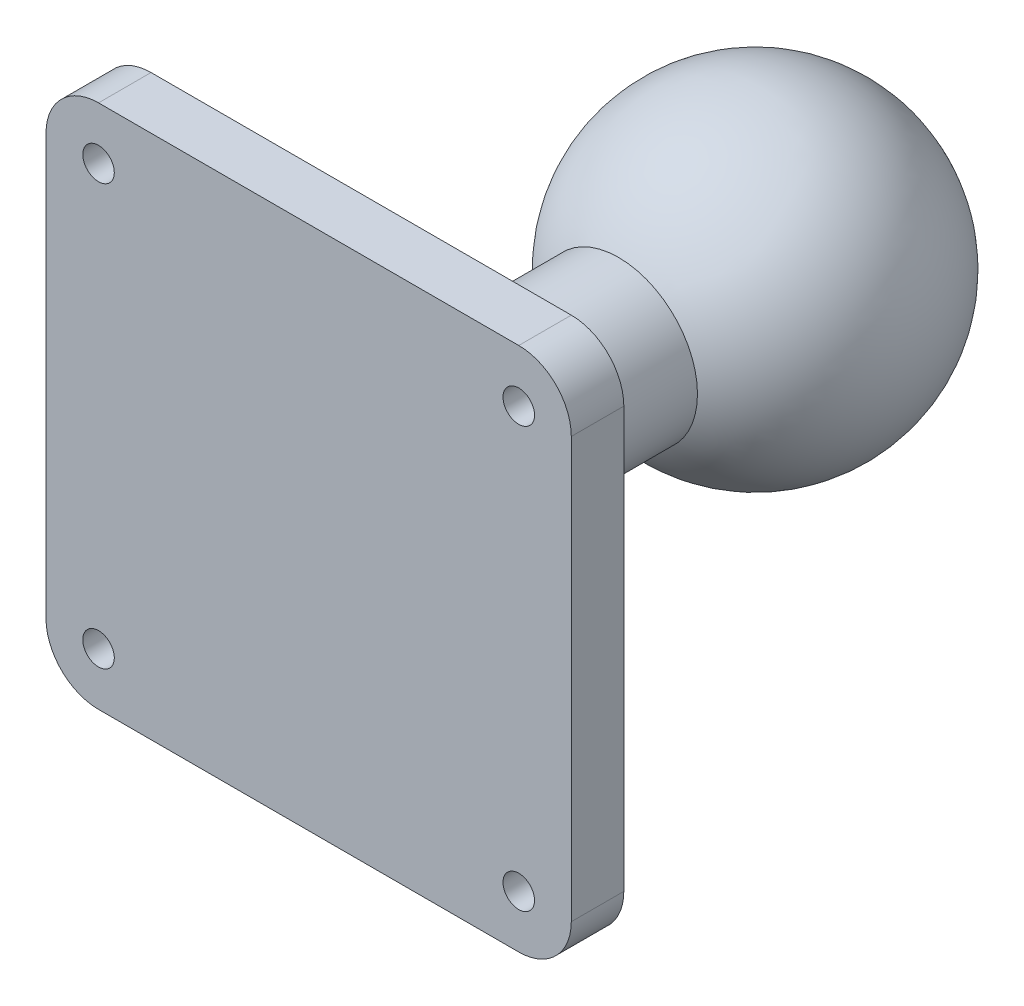
ISO-10303-21;
HEADER;
FILE_DESCRIPTION(('STEP AP214'),'2;1');
FILE_NAME('part.step','',(''),(''),'','','');
FILE_SCHEMA(('AUTOMOTIVE_DESIGN { 1 0 10303 214 1 1 1 1 }'));
ENDSEC;
DATA;
#1=APPLICATION_CONTEXT('core data for automotive mechanical design processes');
#2=APPLICATION_PROTOCOL_DEFINITION('international standard','automotive_design',2000,#1);
#3=PRODUCT_CONTEXT('',#1,'mechanical');
#4=PRODUCT('Part','Part','',(#3));
#5=PRODUCT_RELATED_PRODUCT_CATEGORY('part','',(#4));
#6=PRODUCT_DEFINITION_FORMATION('','',#4);
#7=PRODUCT_DEFINITION_CONTEXT('part definition',#1,'design');
#8=PRODUCT_DEFINITION('design','',#6,#7);
#9=PRODUCT_DEFINITION_SHAPE('','',#8);
#10=(LENGTH_UNIT() NAMED_UNIT(*) SI_UNIT(.MILLI.,.METRE.));
#11=(NAMED_UNIT(*) PLANE_ANGLE_UNIT() SI_UNIT($,.RADIAN.));
#12=(NAMED_UNIT(*) SI_UNIT($,.STERADIAN.) SOLID_ANGLE_UNIT());
#13=UNCERTAINTY_MEASURE_WITH_UNIT(LENGTH_MEASURE(1.E-05),#10,'distance_accuracy_value','');
#14=(GEOMETRIC_REPRESENTATION_CONTEXT(3) GLOBAL_UNCERTAINTY_ASSIGNED_CONTEXT((#13)) GLOBAL_UNIT_ASSIGNED_CONTEXT((#10,
#11,#12)) REPRESENTATION_CONTEXT('',''));
#15=CARTESIAN_POINT('',(0.,0.,0.));
#16=DIRECTION('',(0.,0.,1.));
#17=DIRECTION('',(1.,0.,0.));
#18=AXIS2_PLACEMENT_3D('',#15,#16,#17);
#19=CARTESIAN_POINT('',(25.,-25.,5.));
#20=DIRECTION('',(-1.,0.,0.));
#21=DIRECTION('',(0.,0.,1.));
#22=AXIS2_PLACEMENT_3D('',#19,#20,#21);
#23=PLANE('',#22);
#24=DIRECTION('',(0.,1.,0.));
#25=VECTOR('',#24,1.);
#26=CARTESIAN_POINT('',(25.,-25.,5.));
#27=LINE('',#26,#25);
#28=CARTESIAN_POINT('',(25.,-20.,5.));
#29=VERTEX_POINT('',#28);
#30=CARTESIAN_POINT('',(25.,20.,5.));
#31=VERTEX_POINT('',#30);
#32=EDGE_CURVE('E135',#29,#31,#27,.T.);
#33=ORIENTED_EDGE('',*,*,#32,.F.);
#34=DIRECTION('',(0.,0.,-1.));
#35=VECTOR('',#34,1.);
#36=CARTESIAN_POINT('',(25.,-20.,5.));
#37=LINE('',#36,#35);
#38=CARTESIAN_POINT('',(25.,-20.,0.));
#39=VERTEX_POINT('',#38);
#40=EDGE_CURVE('E119',#29,#39,#37,.T.);
#41=ORIENTED_EDGE('',*,*,#40,.T.);
#42=DIRECTION('',(0.,1.,0.));
#43=VECTOR('',#42,1.);
#44=CARTESIAN_POINT('',(25.,-25.,0.));
#45=LINE('',#44,#43);
#46=CARTESIAN_POINT('',(25.,20.,0.));
#47=VERTEX_POINT('',#46);
#48=EDGE_CURVE('E132',#39,#47,#45,.T.);
#49=ORIENTED_EDGE('',*,*,#48,.T.);
#50=DIRECTION('',(0.,0.,-1.));
#51=VECTOR('',#50,1.);
#52=CARTESIAN_POINT('',(25.,20.,5.));
#53=LINE('',#52,#51);
#54=EDGE_CURVE('E138',#47,#31,#53,.F.);
#55=ORIENTED_EDGE('',*,*,#54,.T.);
#56=EDGE_LOOP('',(#33,#41,#49,#55));
#57=FACE_BOUND('',#56,.T.);
#58=ADVANCED_FACE('F47',(#57),#23,.F.);
#59=CARTESIAN_POINT('',(-25.,25.,5.));
#60=DIRECTION('',(0.,-1.,0.));
#61=DIRECTION('',(0.,0.,-1.));
#62=AXIS2_PLACEMENT_3D('',#59,#60,#61);
#63=PLANE('',#62);
#64=DIRECTION('',(-1.,0.,0.));
#65=VECTOR('',#64,1.);
#66=CARTESIAN_POINT('',(-25.,25.,0.));
#67=LINE('',#66,#65);
#68=CARTESIAN_POINT('',(20.,25.,0.));
#69=VERTEX_POINT('',#68);
#70=CARTESIAN_POINT('',(-20.,25.,0.));
#71=VERTEX_POINT('',#70);
#72=EDGE_CURVE('E143',#69,#71,#67,.T.);
#73=ORIENTED_EDGE('',*,*,#72,.T.);
#74=DIRECTION('',(0.,0.,-1.));
#75=VECTOR('',#74,1.);
#76=CARTESIAN_POINT('',(-20.,25.,5.));
#77=LINE('',#76,#75);
#78=CARTESIAN_POINT('',(-20.,25.,5.));
#79=VERTEX_POINT('',#78);
#80=EDGE_CURVE('E198',#71,#79,#77,.F.);
#81=ORIENTED_EDGE('',*,*,#80,.T.);
#82=DIRECTION('',(-1.,0.,0.));
#83=VECTOR('',#82,1.);
#84=CARTESIAN_POINT('',(-25.,25.,5.));
#85=LINE('',#84,#83);
#86=CARTESIAN_POINT('',(20.,25.,5.));
#87=VERTEX_POINT('',#86);
#88=EDGE_CURVE('E252',#87,#79,#85,.T.);
#89=ORIENTED_EDGE('',*,*,#88,.F.);
#90=DIRECTION('',(0.,0.,-1.));
#91=VECTOR('',#90,1.);
#92=CARTESIAN_POINT('',(20.,25.,5.));
#93=LINE('',#92,#91);
#94=EDGE_CURVE('E194',#87,#69,#93,.T.);
#95=ORIENTED_EDGE('',*,*,#94,.T.);
#96=EDGE_LOOP('',(#73,#81,#89,#95));
#97=FACE_BOUND('',#96,.T.);
#98=ADVANCED_FACE('F218',(#97),#63,.F.);
#99=CARTESIAN_POINT('',(-25.,-25.,5.));
#100=DIRECTION('',(1.,0.,0.));
#101=DIRECTION('',(0.,0.,-1.));
#102=AXIS2_PLACEMENT_3D('',#99,#100,#101);
#103=PLANE('',#102);
#104=DIRECTION('',(0.,-1.,0.));
#105=VECTOR('',#104,1.);
#106=CARTESIAN_POINT('',(-25.,-25.,0.));
#107=LINE('',#106,#105);
#108=CARTESIAN_POINT('',(-25.,20.,0.));
#109=VERTEX_POINT('',#108);
#110=CARTESIAN_POINT('',(-25.,-20.,0.));
#111=VERTEX_POINT('',#110);
#112=EDGE_CURVE('E149',#109,#111,#107,.T.);
#113=ORIENTED_EDGE('',*,*,#112,.T.);
#114=DIRECTION('',(0.,0.,-1.));
#115=VECTOR('',#114,1.);
#116=CARTESIAN_POINT('',(-25.,-20.,5.));
#117=LINE('',#116,#115);
#118=CARTESIAN_POINT('',(-25.,-20.,5.));
#119=VERTEX_POINT('',#118);
#120=EDGE_CURVE('E63',#111,#119,#117,.F.);
#121=ORIENTED_EDGE('',*,*,#120,.T.);
#122=DIRECTION('',(0.,-1.,0.));
#123=VECTOR('',#122,1.);
#124=CARTESIAN_POINT('',(-25.,-25.,5.));
#125=LINE('',#124,#123);
#126=CARTESIAN_POINT('',(-25.,20.,5.));
#127=VERTEX_POINT('',#126);
#128=EDGE_CURVE('E243',#127,#119,#125,.T.);
#129=ORIENTED_EDGE('',*,*,#128,.F.);
#130=DIRECTION('',(0.,0.,-1.));
#131=VECTOR('',#130,1.);
#132=CARTESIAN_POINT('',(-25.,20.,5.));
#133=LINE('',#132,#131);
#134=EDGE_CURVE('E188',#127,#109,#133,.T.);
#135=ORIENTED_EDGE('',*,*,#134,.T.);
#136=EDGE_LOOP('',(#113,#121,#129,#135));
#137=FACE_BOUND('',#136,.T.);
#138=ADVANCED_FACE('F224',(#137),#103,.F.);
#139=CARTESIAN_POINT('',(-25.,-25.,5.));
#140=DIRECTION('',(0.,1.,0.));
#141=DIRECTION('',(0.,0.,1.));
#142=AXIS2_PLACEMENT_3D('',#139,#140,#141);
#143=PLANE('',#142);
#144=DIRECTION('',(1.,0.,0.));
#145=VECTOR('',#144,1.);
#146=CARTESIAN_POINT('',(-25.,-25.,0.));
#147=LINE('',#146,#145);
#148=CARTESIAN_POINT('',(-20.,-25.,0.));
#149=VERTEX_POINT('',#148);
#150=CARTESIAN_POINT('',(20.,-25.,0.));
#151=VERTEX_POINT('',#150);
#152=EDGE_CURVE('E160',#149,#151,#147,.T.);
#153=ORIENTED_EDGE('',*,*,#152,.T.);
#154=DIRECTION('',(0.,0.,-1.));
#155=VECTOR('',#154,1.);
#156=CARTESIAN_POINT('',(20.,-25.,5.));
#157=LINE('',#156,#155);
#158=CARTESIAN_POINT('',(20.,-25.,5.));
#159=VERTEX_POINT('',#158);
#160=EDGE_CURVE('E120',#151,#159,#157,.F.);
#161=ORIENTED_EDGE('',*,*,#160,.T.);
#162=DIRECTION('',(1.,0.,0.));
#163=VECTOR('',#162,1.);
#164=CARTESIAN_POINT('',(-25.,-25.,5.));
#165=LINE('',#164,#163);
#166=CARTESIAN_POINT('',(-20.,-25.,5.));
#167=VERTEX_POINT('',#166);
#168=EDGE_CURVE('E155',#167,#159,#165,.T.);
#169=ORIENTED_EDGE('',*,*,#168,.F.);
#170=DIRECTION('',(0.,0.,-1.));
#171=VECTOR('',#170,1.);
#172=CARTESIAN_POINT('',(-20.,-25.,5.));
#173=LINE('',#172,#171);
#174=EDGE_CURVE('E126',#167,#149,#173,.T.);
#175=ORIENTED_EDGE('',*,*,#174,.T.);
#176=EDGE_LOOP('',(#153,#161,#169,#175));
#177=FACE_BOUND('',#176,.T.);
#178=ADVANCED_FACE('F248',(#177),#143,.F.);
#179=CARTESIAN_POINT('',(0.,0.,5.));
#180=DIRECTION('',(0.,0.,-1.));
#181=DIRECTION('',(-1.,0.,0.));
#182=AXIS2_PLACEMENT_3D('',#179,#180,#181);
#183=PLANE('',#182);
#184=CARTESIAN_POINT('',(20.,-20.,5.));
#185=DIRECTION('',(0.,0.,-1.));
#186=DIRECTION('',(1.,0.,0.));
#187=AXIS2_PLACEMENT_3D('',#184,#185,#186);
#188=CIRCLE('',#187,1.5);
#189=CARTESIAN_POINT('',(21.5,-20.,5.));
#190=VERTEX_POINT('',#189);
#191=EDGE_CURVE('E266',#190,#190,#188,.T.);
#192=ORIENTED_EDGE('',*,*,#191,.T.);
#193=EDGE_LOOP('',(#192));
#194=FACE_BOUND('',#193,.T.);
#195=CARTESIAN_POINT('',(-20.,-20.,5.));
#196=DIRECTION('',(0.,0.,-1.));
#197=DIRECTION('',(-1.,0.,0.));
#198=AXIS2_PLACEMENT_3D('',#195,#196,#197);
#199=CIRCLE('',#198,1.5);
#200=CARTESIAN_POINT('',(-21.5,-20.,5.));
#201=VERTEX_POINT('',#200);
#202=EDGE_CURVE('E274',#201,#201,#199,.T.);
#203=ORIENTED_EDGE('',*,*,#202,.T.);
#204=EDGE_LOOP('',(#203));
#205=FACE_BOUND('',#204,.T.);
#206=CARTESIAN_POINT('',(-20.,20.,5.));
#207=DIRECTION('',(0.,0.,-1.));
#208=DIRECTION('',(1.,0.,0.));
#209=AXIS2_PLACEMENT_3D('',#206,#207,#208);
#210=CIRCLE('',#209,1.5);
#211=CARTESIAN_POINT('',(-18.5,20.,5.));
#212=VERTEX_POINT('',#211);
#213=EDGE_CURVE('E282',#212,#212,#210,.T.);
#214=ORIENTED_EDGE('',*,*,#213,.T.);
#215=EDGE_LOOP('',(#214));
#216=FACE_BOUND('',#215,.T.);
#217=CARTESIAN_POINT('',(20.,20.,5.));
#218=DIRECTION('',(0.,0.,-1.));
#219=DIRECTION('',(-1.,0.,0.));
#220=AXIS2_PLACEMENT_3D('',#217,#218,#219);
#221=CIRCLE('',#220,1.5);
#222=CARTESIAN_POINT('',(18.5,20.,5.));
#223=VERTEX_POINT('',#222);
#224=EDGE_CURVE('E152',#223,#223,#221,.T.);
#225=ORIENTED_EDGE('',*,*,#224,.T.);
#226=EDGE_LOOP('',(#225));
#227=FACE_BOUND('',#226,.T.);
#228=ORIENTED_EDGE('',*,*,#168,.T.);
#229=CARTESIAN_POINT('',(20.,-20.,5.));
#230=DIRECTION('',(0.,0.,-1.));
#231=DIRECTION('',(-1.,0.,0.));
#232=AXIS2_PLACEMENT_3D('',#229,#230,#231);
#233=CIRCLE('',#232,5.);
#234=EDGE_CURVE('E185',#159,#29,#233,.F.);
#235=ORIENTED_EDGE('',*,*,#234,.T.);
#236=ORIENTED_EDGE('',*,*,#32,.T.);
#237=CARTESIAN_POINT('',(20.,20.,5.));
#238=DIRECTION('',(0.,0.,-1.));
#239=DIRECTION('',(-1.,0.,0.));
#240=AXIS2_PLACEMENT_3D('',#237,#238,#239);
#241=CIRCLE('',#240,5.);
#242=EDGE_CURVE('E177',#31,#87,#241,.F.);
#243=ORIENTED_EDGE('',*,*,#242,.T.);
#244=ORIENTED_EDGE('',*,*,#88,.T.);
#245=CARTESIAN_POINT('',(-20.,20.,5.));
#246=DIRECTION('',(0.,0.,-1.));
#247=DIRECTION('',(-1.,0.,0.));
#248=AXIS2_PLACEMENT_3D('',#245,#246,#247);
#249=CIRCLE('',#248,5.);
#250=EDGE_CURVE('E70',#79,#127,#249,.F.);
#251=ORIENTED_EDGE('',*,*,#250,.T.);
#252=ORIENTED_EDGE('',*,*,#128,.T.);
#253=CARTESIAN_POINT('',(-20.,-20.,5.));
#254=DIRECTION('',(0.,0.,-1.));
#255=DIRECTION('',(-1.,0.,0.));
#256=AXIS2_PLACEMENT_3D('',#253,#254,#255);
#257=CIRCLE('',#256,5.);
#258=EDGE_CURVE('E182',#119,#167,#257,.F.);
#259=ORIENTED_EDGE('',*,*,#258,.T.);
#260=EDGE_LOOP('',(#228,#235,#236,#243,#244,#251,#252,#259));
#261=FACE_BOUND('',#260,.T.);
#262=ADVANCED_FACE('F294',(#194,#205,#216,#227,#261),#183,.F.);
#263=CARTESIAN_POINT('',(0.,0.,0.));
#264=DIRECTION('',(0.,0.,-1.));
#265=DIRECTION('',(-1.,0.,0.));
#266=AXIS2_PLACEMENT_3D('',#263,#264,#265);
#267=PLANE('',#266);
#268=CARTESIAN_POINT('',(0.,0.,0.));
#269=DIRECTION('',(0.,0.,-1.));
#270=DIRECTION('',(-1.,0.,0.));
#271=AXIS2_PLACEMENT_3D('',#268,#269,#270);
#272=CIRCLE('',#271,12.5);
#273=CARTESIAN_POINT('',(-12.5,0.,0.));
#274=VERTEX_POINT('',#273);
#275=EDGE_CURVE('E11',#274,#274,#272,.F.);
#276=ORIENTED_EDGE('',*,*,#275,.T.);
#277=EDGE_LOOP('',(#276));
#278=FACE_BOUND('',#277,.T.);
#279=CARTESIAN_POINT('',(20.,-20.,0.));
#280=DIRECTION('',(0.,0.,-1.));
#281=DIRECTION('',(1.,0.,0.));
#282=AXIS2_PLACEMENT_3D('',#279,#280,#281);
#283=CIRCLE('',#282,1.5);
#284=CARTESIAN_POINT('',(21.5,-20.,0.));
#285=VERTEX_POINT('',#284);
#286=EDGE_CURVE('E270',#285,#285,#283,.T.);
#287=ORIENTED_EDGE('',*,*,#286,.F.);
#288=EDGE_LOOP('',(#287));
#289=FACE_BOUND('',#288,.T.);
#290=CARTESIAN_POINT('',(-20.,-20.,0.));
#291=DIRECTION('',(0.,0.,-1.));
#292=DIRECTION('',(-1.,0.,0.));
#293=AXIS2_PLACEMENT_3D('',#290,#291,#292);
#294=CIRCLE('',#293,1.5);
#295=CARTESIAN_POINT('',(-21.5,-20.,0.));
#296=VERTEX_POINT('',#295);
#297=EDGE_CURVE('E278',#296,#296,#294,.T.);
#298=ORIENTED_EDGE('',*,*,#297,.F.);
#299=EDGE_LOOP('',(#298));
#300=FACE_BOUND('',#299,.T.);
#301=CARTESIAN_POINT('',(-20.,20.,0.));
#302=DIRECTION('',(0.,0.,-1.));
#303=DIRECTION('',(1.,0.,0.));
#304=AXIS2_PLACEMENT_3D('',#301,#302,#303);
#305=CIRCLE('',#304,1.5);
#306=CARTESIAN_POINT('',(-18.5,20.,0.));
#307=VERTEX_POINT('',#306);
#308=EDGE_CURVE('E262',#307,#307,#305,.T.);
#309=ORIENTED_EDGE('',*,*,#308,.F.);
#310=EDGE_LOOP('',(#309));
#311=FACE_BOUND('',#310,.T.);
#312=CARTESIAN_POINT('',(20.,20.,0.));
#313=DIRECTION('',(0.,0.,-1.));
#314=DIRECTION('',(-1.,0.,0.));
#315=AXIS2_PLACEMENT_3D('',#312,#313,#314);
#316=CIRCLE('',#315,1.5);
#317=CARTESIAN_POINT('',(18.5,20.,0.));
#318=VERTEX_POINT('',#317);
#319=EDGE_CURVE('E258',#318,#318,#316,.T.);
#320=ORIENTED_EDGE('',*,*,#319,.F.);
#321=EDGE_LOOP('',(#320));
#322=FACE_BOUND('',#321,.T.);
#323=ORIENTED_EDGE('',*,*,#48,.F.);
#324=CARTESIAN_POINT('',(20.,-20.,0.));
#325=DIRECTION('',(0.,0.,-1.));
#326=DIRECTION('',(-1.,0.,0.));
#327=AXIS2_PLACEMENT_3D('',#324,#325,#326);
#328=CIRCLE('',#327,5.);
#329=EDGE_CURVE('E115',#39,#151,#328,.T.);
#330=ORIENTED_EDGE('',*,*,#329,.T.);
#331=ORIENTED_EDGE('',*,*,#152,.F.);
#332=CARTESIAN_POINT('',(-20.,-20.,0.));
#333=DIRECTION('',(0.,0.,-1.));
#334=DIRECTION('',(-1.,0.,0.));
#335=AXIS2_PLACEMENT_3D('',#332,#333,#334);
#336=CIRCLE('',#335,5.);
#337=EDGE_CURVE('E127',#149,#111,#336,.T.);
#338=ORIENTED_EDGE('',*,*,#337,.T.);
#339=ORIENTED_EDGE('',*,*,#112,.F.);
#340=CARTESIAN_POINT('',(-20.,20.,0.));
#341=DIRECTION('',(0.,0.,-1.));
#342=DIRECTION('',(-1.,0.,0.));
#343=AXIS2_PLACEMENT_3D('',#340,#341,#342);
#344=CIRCLE('',#343,5.);
#345=EDGE_CURVE('E167',#109,#71,#344,.T.);
#346=ORIENTED_EDGE('',*,*,#345,.T.);
#347=ORIENTED_EDGE('',*,*,#72,.F.);
#348=CARTESIAN_POINT('',(20.,20.,0.));
#349=DIRECTION('',(0.,0.,-1.));
#350=DIRECTION('',(-1.,0.,0.));
#351=AXIS2_PLACEMENT_3D('',#348,#349,#350);
#352=CIRCLE('',#351,5.);
#353=EDGE_CURVE('E137',#69,#47,#352,.T.);
#354=ORIENTED_EDGE('',*,*,#353,.T.);
#355=EDGE_LOOP('',(#323,#330,#331,#338,#339,#346,#347,#354));
#356=FACE_BOUND('',#355,.T.);
#357=ADVANCED_FACE('F140',(#278,#289,#300,#311,#322,#356),#267,.T.);
#358=CARTESIAN_POINT('',(0.,0.,-52.501));
#359=DIRECTION('',(0.,0.,1.));
#360=DIRECTION('',(1.,0.,0.));
#361=AXIS2_PLACEMENT_3D('',#358,#359,#360);
#362=CYLINDRICAL_SURFACE('',#361,7.5);
#363=CARTESIAN_POINT('',(0.,0.,-5.));
#364=DIRECTION('',(0.,0.,-1.));
#365=DIRECTION('',(-1.,0.,0.));
#366=AXIS2_PLACEMENT_3D('',#363,#364,#365);
#367=CIRCLE('',#366,7.5);
#368=CARTESIAN_POINT('',(7.5,0.,-5.));
#369=VERTEX_POINT('',#368);
#370=EDGE_CURVE('E56',#369,#369,#367,.T.);
#371=CARTESIAN_POINT('',(0.,0.,-24.5096189432334));
#372=DIRECTION('',(0.,0.,-1.));
#373=DIRECTION('',(-1.,0.,0.));
#374=AXIS2_PLACEMENT_3D('',#371,#372,#373);
#375=CIRCLE('',#374,7.5);
#376=CARTESIAN_POINT('',(7.5,0.,-24.5096189432334));
#377=VERTEX_POINT('',#376);
#378=EDGE_CURVE('E144',#377,#377,#375,.T.);
#379=CARTESIAN_POINT('',(7.5,0.,-5.));
#380=CARTESIAN_POINT('',(7.5,0.,-5.20322519732535));
#381=CARTESIAN_POINT('',(7.5,0.,-5.4064503946507));
#382=CARTESIAN_POINT('',(7.5,0.,-5.81290078930139));
#383=CARTESIAN_POINT('',(7.5,0.,-6.01612598662675));
#384=CARTESIAN_POINT('',(7.5,0.,-6.42257638127744));
#385=CARTESIAN_POINT('',(7.5,0.,-6.62580157860279));
#386=CARTESIAN_POINT('',(7.5,0.,-7.03225197325349));
#387=CARTESIAN_POINT('',(7.5,0.,-7.23547717057884));
#388=CARTESIAN_POINT('',(7.5,0.,-7.64192756522953));
#389=CARTESIAN_POINT('',(7.5,0.,-7.84515276255488));
#390=CARTESIAN_POINT('',(7.5,0.,-8.25160315720557));
#391=CARTESIAN_POINT('',(7.5,0.,-8.45482835453092));
#392=CARTESIAN_POINT('',(7.5,0.,-8.86127874918162));
#393=CARTESIAN_POINT('',(7.5,0.,-9.06450394650697));
#394=CARTESIAN_POINT('',(7.5,0.,-9.47095434115766));
#395=CARTESIAN_POINT('',(7.5,0.,-9.67417953848301));
#396=CARTESIAN_POINT('',(7.5,0.,-10.0806299331337));
#397=CARTESIAN_POINT('',(7.5,0.,-10.2838551304591));
#398=CARTESIAN_POINT('',(7.5,0.,-10.6903055251098));
#399=CARTESIAN_POINT('',(7.5,0.,-10.8935307224351));
#400=CARTESIAN_POINT('',(7.5,0.,-11.2999811170858));
#401=CARTESIAN_POINT('',(7.5,0.,-11.5032063144111));
#402=CARTESIAN_POINT('',(7.5,0.,-11.9096567090618));
#403=CARTESIAN_POINT('',(7.5,0.,-12.1128819063872));
#404=CARTESIAN_POINT('',(7.5,0.,-12.5193323010379));
#405=CARTESIAN_POINT('',(7.5,0.,-12.7225574983632));
#406=CARTESIAN_POINT('',(7.5,0.,-13.1290078930139));
#407=CARTESIAN_POINT('',(7.5,0.,-13.3322330903393));
#408=CARTESIAN_POINT('',(7.5,0.,-13.73868348499));
#409=CARTESIAN_POINT('',(7.5,0.,-13.9419086823153));
#410=CARTESIAN_POINT('',(7.5,0.,-14.348359076966));
#411=CARTESIAN_POINT('',(7.5,0.,-14.5515842742914));
#412=CARTESIAN_POINT('',(7.5,0.,-14.9580346689421));
#413=CARTESIAN_POINT('',(7.5,0.,-15.1612598662674));
#414=CARTESIAN_POINT('',(7.5,0.,-15.5677102609181));
#415=CARTESIAN_POINT('',(7.5,0.,-15.7709354582435));
#416=CARTESIAN_POINT('',(7.5,0.,-16.1773858528942));
#417=CARTESIAN_POINT('',(7.5,0.,-16.3806110502195));
#418=CARTESIAN_POINT('',(7.5,0.,-16.7870614448702));
#419=CARTESIAN_POINT('',(7.5,0.,-16.9902866421955));
#420=CARTESIAN_POINT('',(7.5,0.,-17.3967370368462));
#421=CARTESIAN_POINT('',(7.5,0.,-17.5999622341716));
#422=CARTESIAN_POINT('',(7.5,0.,-18.0064126288223));
#423=CARTESIAN_POINT('',(7.5,0.,-18.2096378261476));
#424=CARTESIAN_POINT('',(7.5,0.,-18.6160882207983));
#425=CARTESIAN_POINT('',(7.5,0.,-18.8193134181237));
#426=CARTESIAN_POINT('',(7.5,0.,-19.2257638127744));
#427=CARTESIAN_POINT('',(7.5,0.,-19.4289890100997));
#428=CARTESIAN_POINT('',(7.5,0.,-19.8354394047504));
#429=CARTESIAN_POINT('',(7.5,0.,-20.0386646020758));
#430=CARTESIAN_POINT('',(7.5,0.,-20.4451149967265));
#431=CARTESIAN_POINT('',(7.5,0.,-20.6483401940518));
#432=CARTESIAN_POINT('',(7.5,0.,-21.0547905887025));
#433=CARTESIAN_POINT('',(7.5,0.,-21.2580157860279));
#434=CARTESIAN_POINT('',(7.5,0.,-21.6644661806785));
#435=CARTESIAN_POINT('',(7.5,0.,-21.8676913780039));
#436=CARTESIAN_POINT('',(7.5,0.,-22.2741417726546));
#437=CARTESIAN_POINT('',(7.5,0.,-22.4773669699799));
#438=CARTESIAN_POINT('',(7.5,0.,-22.8838173646306));
#439=CARTESIAN_POINT('',(7.5,0.,-23.087042561956));
#440=CARTESIAN_POINT('',(7.5,0.,-23.4934929566067));
#441=CARTESIAN_POINT('',(7.5,0.,-23.696718153932));
#442=CARTESIAN_POINT('',(7.5,0.,-24.1031685485827));
#443=CARTESIAN_POINT('',(7.5,0.,-24.3063937459081));
#444=CARTESIAN_POINT('',(7.5,0.,-24.5096189432334));
#445=B_SPLINE_CURVE_WITH_KNOTS('',3,(#379,#380,#381,#382,#383,#384,#385,#386,#387,#388,#389,
#390,#391,#392,#393,#394,#395,#396,#397,#398,#399,#400,#401,#402,#403,#404,#405,#406,#407,#408,
#409,#410,#411,#412,#413,#414,#415,#416,#417,#418,#419,#420,#421,#422,#423,#424,#425,#426,#427,
#428,#429,#430,#431,#432,#433,#434,#435,#436,#437,#438,#439,#440,#441,#442,#443,#444),
.UNSPECIFIED.,.F.,.F.,(4,2,2,2,2,2,2,2,2,2,2,2,2,2,2,2,2,2,2,2,2,2,2,2,2,2,2,2,2,2,2,2,4),(0.,
0.609675591976042,1.21935118395209,1.82902677592813,2.43870236790418,3.04837795988022,
3.65805355185626,4.26772914383231,4.87740473580835,5.4870803277844,6.09675591976044,
6.70643151173649,7.31610710371253,7.92578269568858,8.53545828766462,9.14513387964067,
9.75480947161671,10.3644850635928,10.9741606555688,11.5838362475448,12.1935118395209,
12.8031874314969,13.412863023473,14.022538615449,14.6322142074251,15.2418897994011,
15.8515653913772,16.4612409833532,17.0709165753292,17.6805921673053,18.2902677592813,
18.8999433512574,19.5096189432334),.UNSPECIFIED.);
#446=EDGE_CURVE('BSEAM204',#369,#377,#445,.T.);
#447=ORIENTED_EDGE('',*,*,#370,.T.);
#448=ORIENTED_EDGE('',*,*,#378,.F.);
#449=ORIENTED_EDGE('',*,*,#446,.T.);
#450=ORIENTED_EDGE('',*,*,#446,.F.);
#451=EDGE_LOOP('',(#447,#449,#448,#450));
#452=FACE_BOUND('',#451,.T.);
#453=ADVANCED_FACE('F204',(#452),#362,.T.);
#454=CARTESIAN_POINT('',(0.,0.,-37.5));
#455=DIRECTION('',(0.,1.,0.));
#456=DIRECTION('',(-1.,0.,0.));
#457=AXIS2_PLACEMENT_3D('',#454,#455,#456);
#458=SPHERICAL_SURFACE('',#457,15.);
#459=CARTESIAN_POINT('',(0.,0.,-37.5));
#460=DIRECTION('',(0.,0.,-1.));
#461=DIRECTION('',(-1.,0.,0.));
#462=AXIS2_PLACEMENT_3D('',#459,#460,#461);
#463=SPHERICAL_SURFACE('',#462,15.);
#464=ORIENTED_EDGE('',*,*,#378,.T.);
#465=EDGE_LOOP('',(#464));
#466=FACE_BOUND('',#465,.T.);
#467=ADVANCED_FACE('F301',(#466),#463,.T.);
#468=CARTESIAN_POINT('',(20.,20.,5.));
#469=DIRECTION('',(0.,0.,-1.));
#470=DIRECTION('',(-1.,0.,0.));
#471=AXIS2_PLACEMENT_3D('',#468,#469,#470);
#472=CYLINDRICAL_SURFACE('',#471,1.5);
#473=ORIENTED_EDGE('',*,*,#224,.F.);
#474=EDGE_LOOP('',(#473));
#475=FACE_BOUND('',#474,.T.);
#476=ORIENTED_EDGE('',*,*,#319,.T.);
#477=EDGE_LOOP('',(#476));
#478=FACE_BOUND('',#477,.T.);
#479=ADVANCED_FACE('F299',(#475,#478),#472,.F.);
#480=CARTESIAN_POINT('',(-20.,20.,5.));
#481=DIRECTION('',(0.,0.,-1.));
#482=DIRECTION('',(-1.,0.,0.));
#483=AXIS2_PLACEMENT_3D('',#480,#481,#482);
#484=CYLINDRICAL_SURFACE('',#483,1.5);
#485=ORIENTED_EDGE('',*,*,#213,.F.);
#486=EDGE_LOOP('',(#485));
#487=FACE_BOUND('',#486,.T.);
#488=ORIENTED_EDGE('',*,*,#308,.T.);
#489=EDGE_LOOP('',(#488));
#490=FACE_BOUND('',#489,.T.);
#491=ADVANCED_FACE('F290',(#487,#490),#484,.F.);
#492=CARTESIAN_POINT('',(-20.,-20.,5.));
#493=DIRECTION('',(0.,0.,-1.));
#494=DIRECTION('',(-1.,0.,0.));
#495=AXIS2_PLACEMENT_3D('',#492,#493,#494);
#496=CYLINDRICAL_SURFACE('',#495,1.5);
#497=ORIENTED_EDGE('',*,*,#202,.F.);
#498=EDGE_LOOP('',(#497));
#499=FACE_BOUND('',#498,.T.);
#500=ORIENTED_EDGE('',*,*,#297,.T.);
#501=EDGE_LOOP('',(#500));
#502=FACE_BOUND('',#501,.T.);
#503=ADVANCED_FACE('F308',(#499,#502),#496,.F.);
#504=CARTESIAN_POINT('',(20.,-20.,5.));
#505=DIRECTION('',(0.,0.,-1.));
#506=DIRECTION('',(-1.,0.,0.));
#507=AXIS2_PLACEMENT_3D('',#504,#505,#506);
#508=CYLINDRICAL_SURFACE('',#507,1.5);
#509=ORIENTED_EDGE('',*,*,#191,.F.);
#510=EDGE_LOOP('',(#509));
#511=FACE_BOUND('',#510,.T.);
#512=ORIENTED_EDGE('',*,*,#286,.T.);
#513=EDGE_LOOP('',(#512));
#514=FACE_BOUND('',#513,.T.);
#515=ADVANCED_FACE('F232',(#511,#514),#508,.F.);
#516=CARTESIAN_POINT('',(20.,-20.,5.));
#517=DIRECTION('',(0.,0.,-1.));
#518=DIRECTION('',(-1.,0.,0.));
#519=AXIS2_PLACEMENT_3D('',#516,#517,#518);
#520=CYLINDRICAL_SURFACE('',#519,5.);
#521=ORIENTED_EDGE('',*,*,#234,.F.);
#522=ORIENTED_EDGE('',*,*,#160,.F.);
#523=ORIENTED_EDGE('',*,*,#329,.F.);
#524=ORIENTED_EDGE('',*,*,#40,.F.);
#525=EDGE_LOOP('',(#521,#522,#523,#524));
#526=FACE_BOUND('',#525,.T.);
#527=ADVANCED_FACE('F118',(#526),#520,.T.);
#528=CARTESIAN_POINT('',(-20.,-20.,5.));
#529=DIRECTION('',(0.,0.,-1.));
#530=DIRECTION('',(-1.,0.,0.));
#531=AXIS2_PLACEMENT_3D('',#528,#529,#530);
#532=CYLINDRICAL_SURFACE('',#531,5.);
#533=ORIENTED_EDGE('',*,*,#258,.F.);
#534=ORIENTED_EDGE('',*,*,#120,.F.);
#535=ORIENTED_EDGE('',*,*,#337,.F.);
#536=ORIENTED_EDGE('',*,*,#174,.F.);
#537=EDGE_LOOP('',(#533,#534,#535,#536));
#538=FACE_BOUND('',#537,.T.);
#539=ADVANCED_FACE('F231',(#538),#532,.T.);
#540=CARTESIAN_POINT('',(-20.,20.,5.));
#541=DIRECTION('',(0.,0.,-1.));
#542=DIRECTION('',(-1.,0.,0.));
#543=AXIS2_PLACEMENT_3D('',#540,#541,#542);
#544=CYLINDRICAL_SURFACE('',#543,5.);
#545=ORIENTED_EDGE('',*,*,#250,.F.);
#546=ORIENTED_EDGE('',*,*,#80,.F.);
#547=ORIENTED_EDGE('',*,*,#345,.F.);
#548=ORIENTED_EDGE('',*,*,#134,.F.);
#549=EDGE_LOOP('',(#545,#546,#547,#548));
#550=FACE_BOUND('',#549,.T.);
#551=ADVANCED_FACE('F214',(#550),#544,.T.);
#552=CARTESIAN_POINT('',(20.,20.,5.));
#553=DIRECTION('',(0.,0.,-1.));
#554=DIRECTION('',(-1.,0.,0.));
#555=AXIS2_PLACEMENT_3D('',#552,#553,#554);
#556=CYLINDRICAL_SURFACE('',#555,5.);
#557=ORIENTED_EDGE('',*,*,#242,.F.);
#558=ORIENTED_EDGE('',*,*,#54,.F.);
#559=ORIENTED_EDGE('',*,*,#353,.F.);
#560=ORIENTED_EDGE('',*,*,#94,.F.);
#561=EDGE_LOOP('',(#557,#558,#559,#560));
#562=FACE_BOUND('',#561,.T.);
#563=ADVANCED_FACE('F208',(#562),#556,.T.);
#564=CARTESIAN_POINT('',(0.,0.,-5.));
#565=DIRECTION('',(0.,0.,-1.));
#566=DIRECTION('',(-1.,0.,0.));
#567=AXIS2_PLACEMENT_3D('',#564,#565,#566);
#568=TOROIDAL_SURFACE('',#567,12.5,5.);
#569=ORIENTED_EDGE('',*,*,#275,.F.);
#570=EDGE_LOOP('',(#569));
#571=FACE_BOUND('',#570,.T.);
#572=ORIENTED_EDGE('',*,*,#370,.F.);
#573=EDGE_LOOP('',(#572));
#574=FACE_BOUND('',#573,.T.);
#575=ADVANCED_FACE('F49',(#571,#574),#568,.F.);
#576=CLOSED_SHELL('',(#58,#98,#138,#178,#262,#357,#453,#467,#479,#491,#503,#515,#527,#539,#551,
#563,#575));
#577=MANIFOLD_SOLID_BREP('B2',#576);
#578=ADVANCED_BREP_SHAPE_REPRESENTATION('',(#18,#577),#14);
#579=SHAPE_DEFINITION_REPRESENTATION(#9,#578);
ENDSEC;
END-ISO-10303-21;
